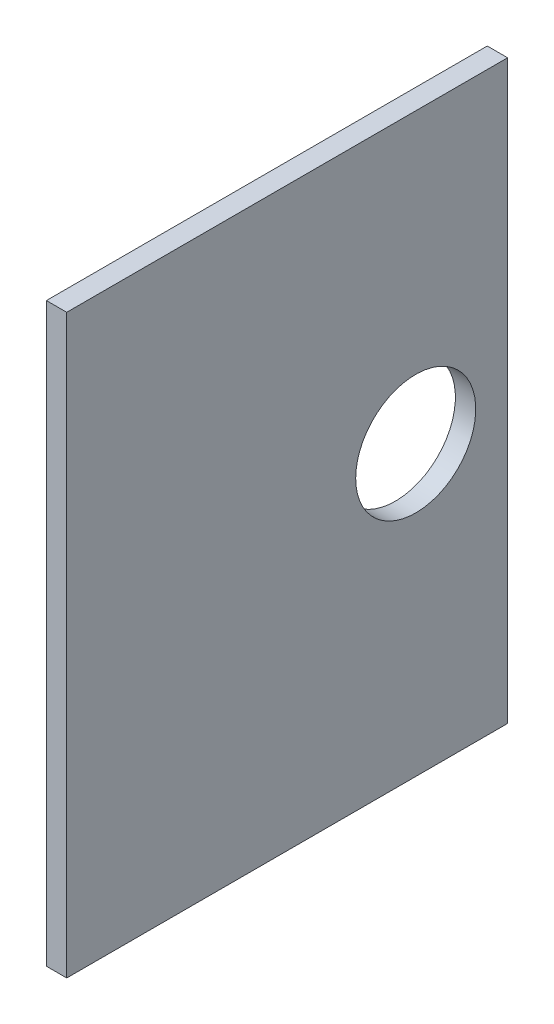
ISO-10303-21;
HEADER;
FILE_DESCRIPTION(('STEP AP214'),'2;1');
FILE_NAME('part.step','',(''),(''),'','','');
FILE_SCHEMA(('AUTOMOTIVE_DESIGN { 1 0 10303 214 1 1 1 1 }'));
ENDSEC;
DATA;
#1=APPLICATION_CONTEXT('core data for automotive mechanical design processes');
#2=APPLICATION_PROTOCOL_DEFINITION('international standard','automotive_design',2000,#1);
#3=PRODUCT_CONTEXT('',#1,'mechanical');
#4=PRODUCT('Part','Part','',(#3));
#5=PRODUCT_RELATED_PRODUCT_CATEGORY('part','',(#4));
#6=PRODUCT_DEFINITION_FORMATION('','',#4);
#7=PRODUCT_DEFINITION_CONTEXT('part definition',#1,'design');
#8=PRODUCT_DEFINITION('design','',#6,#7);
#9=PRODUCT_DEFINITION_SHAPE('','',#8);
#10=(LENGTH_UNIT() NAMED_UNIT(*) SI_UNIT(.MILLI.,.METRE.));
#11=(NAMED_UNIT(*) PLANE_ANGLE_UNIT() SI_UNIT($,.RADIAN.));
#12=(NAMED_UNIT(*) SI_UNIT($,.STERADIAN.) SOLID_ANGLE_UNIT());
#13=UNCERTAINTY_MEASURE_WITH_UNIT(LENGTH_MEASURE(1.E-05),#10,'distance_accuracy_value','');
#14=(GEOMETRIC_REPRESENTATION_CONTEXT(3) GLOBAL_UNCERTAINTY_ASSIGNED_CONTEXT((#13)) GLOBAL_UNIT_ASSIGNED_CONTEXT((#10,
#11,#12)) REPRESENTATION_CONTEXT('',''));
#15=CARTESIAN_POINT('',(0.,0.,0.));
#16=DIRECTION('',(0.,0.,1.));
#17=DIRECTION('',(1.,0.,0.));
#18=AXIS2_PLACEMENT_3D('',#15,#16,#17);
#19=CARTESIAN_POINT('',(7.62,0.,0.));
#20=DIRECTION('',(-1.,0.,0.));
#21=DIRECTION('',(0.,0.,1.));
#22=AXIS2_PLACEMENT_3D('',#19,#20,#21);
#23=PLANE('',#22);
#24=DIRECTION('',(0.,1.,0.));
#25=VECTOR('',#24,1.);
#26=CARTESIAN_POINT('',(7.62,-107.95,-82.55));
#27=LINE('',#26,#25);
#28=CARTESIAN_POINT('',(7.62,-107.95,-82.55));
#29=VERTEX_POINT('',#28);
#30=CARTESIAN_POINT('',(7.62,107.95,-82.55));
#31=VERTEX_POINT('',#30);
#32=EDGE_CURVE('E85',#29,#31,#27,.T.);
#33=ORIENTED_EDGE('',*,*,#32,.T.);
#34=DIRECTION('',(0.,0.,1.));
#35=VECTOR('',#34,1.);
#36=CARTESIAN_POINT('',(7.62,107.95,82.55));
#37=LINE('',#36,#35);
#38=CARTESIAN_POINT('',(7.62,107.95,82.55));
#39=VERTEX_POINT('',#38);
#40=EDGE_CURVE('E80',#31,#39,#37,.T.);
#41=ORIENTED_EDGE('',*,*,#40,.T.);
#42=DIRECTION('',(0.,-1.,0.));
#43=VECTOR('',#42,1.);
#44=CARTESIAN_POINT('',(7.62,-107.95,82.55));
#45=LINE('',#44,#43);
#46=CARTESIAN_POINT('',(7.62,-107.95,82.55));
#47=VERTEX_POINT('',#46);
#48=EDGE_CURVE('E83',#39,#47,#45,.T.);
#49=ORIENTED_EDGE('',*,*,#48,.T.);
#50=DIRECTION('',(0.,0.,-1.));
#51=VECTOR('',#50,1.);
#52=CARTESIAN_POINT('',(7.62,-107.95,82.55));
#53=LINE('',#52,#51);
#54=EDGE_CURVE('E50',#47,#29,#53,.T.);
#55=ORIENTED_EDGE('',*,*,#54,.T.);
#56=EDGE_LOOP('',(#33,#41,#49,#55));
#57=FACE_BOUND('',#56,.T.);
#58=CARTESIAN_POINT('',(7.62,0.,-48.1329067055647));
#59=DIRECTION('',(1.,0.,0.));
#60=DIRECTION('',(0.,0.,-1.));
#61=AXIS2_PLACEMENT_3D('',#58,#59,#60);
#62=CIRCLE('',#61,22.479);
#63=CARTESIAN_POINT('',(7.62,0.,-25.6539067055647));
#64=VERTEX_POINT('',#63);
#65=EDGE_CURVE('E100',#64,#64,#62,.T.);
#66=ORIENTED_EDGE('',*,*,#65,.F.);
#67=EDGE_LOOP('',(#66));
#68=FACE_BOUND('',#67,.T.);
#69=ADVANCED_FACE('F33',(#57,#68),#23,.F.);
#70=CARTESIAN_POINT('',(0.,0.,0.));
#71=DIRECTION('',(-1.,0.,0.));
#72=DIRECTION('',(0.,0.,1.));
#73=AXIS2_PLACEMENT_3D('',#70,#71,#72);
#74=PLANE('',#73);
#75=DIRECTION('',(0.,1.,0.));
#76=VECTOR('',#75,1.);
#77=CARTESIAN_POINT('',(0.,-107.95,-82.55));
#78=LINE('',#77,#76);
#79=CARTESIAN_POINT('',(0.,-107.95,-82.55));
#80=VERTEX_POINT('',#79);
#81=CARTESIAN_POINT('',(0.,107.95,-82.55));
#82=VERTEX_POINT('',#81);
#83=EDGE_CURVE('E97',#80,#82,#78,.T.);
#84=ORIENTED_EDGE('',*,*,#83,.F.);
#85=DIRECTION('',(0.,0.,-1.));
#86=VECTOR('',#85,1.);
#87=CARTESIAN_POINT('',(0.,-107.95,82.55));
#88=LINE('',#87,#86);
#89=CARTESIAN_POINT('',(0.,-107.95,82.55));
#90=VERTEX_POINT('',#89);
#91=EDGE_CURVE('E73',#90,#80,#88,.T.);
#92=ORIENTED_EDGE('',*,*,#91,.F.);
#93=DIRECTION('',(0.,-1.,0.));
#94=VECTOR('',#93,1.);
#95=CARTESIAN_POINT('',(0.,-107.95,82.55));
#96=LINE('',#95,#94);
#97=CARTESIAN_POINT('',(0.,107.95,82.55));
#98=VERTEX_POINT('',#97);
#99=EDGE_CURVE('E67',#98,#90,#96,.T.);
#100=ORIENTED_EDGE('',*,*,#99,.F.);
#101=DIRECTION('',(0.,0.,1.));
#102=VECTOR('',#101,1.);
#103=CARTESIAN_POINT('',(0.,107.95,82.55));
#104=LINE('',#103,#102);
#105=EDGE_CURVE('E89',#82,#98,#104,.T.);
#106=ORIENTED_EDGE('',*,*,#105,.F.);
#107=EDGE_LOOP('',(#84,#92,#100,#106));
#108=FACE_BOUND('',#107,.T.);
#109=CARTESIAN_POINT('',(0.,0.,-48.1329067055647));
#110=DIRECTION('',(1.,0.,0.));
#111=DIRECTION('',(0.,0.,-1.));
#112=AXIS2_PLACEMENT_3D('',#109,#110,#111);
#113=CIRCLE('',#112,22.479);
#114=CARTESIAN_POINT('',(0.,0.,-25.6539067055647));
#115=VERTEX_POINT('',#114);
#116=EDGE_CURVE('E112',#115,#115,#113,.T.);
#117=ORIENTED_EDGE('',*,*,#116,.T.);
#118=EDGE_LOOP('',(#117));
#119=FACE_BOUND('',#118,.T.);
#120=ADVANCED_FACE('F108',(#108,#119),#74,.T.);
#121=CARTESIAN_POINT('',(7.62,-107.95,-82.55));
#122=DIRECTION('',(0.,0.,1.));
#123=DIRECTION('',(1.,0.,0.));
#124=AXIS2_PLACEMENT_3D('',#121,#122,#123);
#125=PLANE('',#124);
#126=ORIENTED_EDGE('',*,*,#83,.T.);
#127=DIRECTION('',(-1.,0.,0.));
#128=VECTOR('',#127,1.);
#129=CARTESIAN_POINT('',(7.62,107.95,-82.55));
#130=LINE('',#129,#128);
#131=EDGE_CURVE('E11',#31,#82,#130,.T.);
#132=ORIENTED_EDGE('',*,*,#131,.F.);
#133=ORIENTED_EDGE('',*,*,#32,.F.);
#134=DIRECTION('',(-1.,0.,0.));
#135=VECTOR('',#134,1.);
#136=CARTESIAN_POINT('',(7.62,-107.95,-82.55));
#137=LINE('',#136,#135);
#138=EDGE_CURVE('E93',#29,#80,#137,.T.);
#139=ORIENTED_EDGE('',*,*,#138,.T.);
#140=EDGE_LOOP('',(#126,#132,#133,#139));
#141=FACE_BOUND('',#140,.T.);
#142=ADVANCED_FACE('F35',(#141),#125,.F.);
#143=CARTESIAN_POINT('',(7.62,107.95,82.55));
#144=DIRECTION('',(0.,-1.,0.));
#145=DIRECTION('',(0.,0.,-1.));
#146=AXIS2_PLACEMENT_3D('',#143,#144,#145);
#147=PLANE('',#146);
#148=ORIENTED_EDGE('',*,*,#105,.T.);
#149=DIRECTION('',(-1.,0.,0.));
#150=VECTOR('',#149,1.);
#151=CARTESIAN_POINT('',(7.62,107.95,82.55));
#152=LINE('',#151,#150);
#153=EDGE_CURVE('E42',#39,#98,#152,.T.);
#154=ORIENTED_EDGE('',*,*,#153,.F.);
#155=ORIENTED_EDGE('',*,*,#40,.F.);
#156=ORIENTED_EDGE('',*,*,#131,.T.);
#157=EDGE_LOOP('',(#148,#154,#155,#156));
#158=FACE_BOUND('',#157,.T.);
#159=ADVANCED_FACE('F88',(#158),#147,.F.);
#160=CARTESIAN_POINT('',(7.62,-107.95,82.55));
#161=DIRECTION('',(0.,0.,-1.));
#162=DIRECTION('',(-1.,0.,0.));
#163=AXIS2_PLACEMENT_3D('',#160,#161,#162);
#164=PLANE('',#163);
#165=ORIENTED_EDGE('',*,*,#99,.T.);
#166=DIRECTION('',(-1.,0.,0.));
#167=VECTOR('',#166,1.);
#168=CARTESIAN_POINT('',(7.62,-107.95,82.55));
#169=LINE('',#168,#167);
#170=EDGE_CURVE('E90',#47,#90,#169,.T.);
#171=ORIENTED_EDGE('',*,*,#170,.F.);
#172=ORIENTED_EDGE('',*,*,#48,.F.);
#173=ORIENTED_EDGE('',*,*,#153,.T.);
#174=EDGE_LOOP('',(#165,#171,#172,#173));
#175=FACE_BOUND('',#174,.T.);
#176=ADVANCED_FACE('F91',(#175),#164,.F.);
#177=CARTESIAN_POINT('',(7.62,-107.95,82.55));
#178=DIRECTION('',(0.,1.,0.));
#179=DIRECTION('',(0.,0.,1.));
#180=AXIS2_PLACEMENT_3D('',#177,#178,#179);
#181=PLANE('',#180);
#182=ORIENTED_EDGE('',*,*,#91,.T.);
#183=ORIENTED_EDGE('',*,*,#138,.F.);
#184=ORIENTED_EDGE('',*,*,#54,.F.);
#185=ORIENTED_EDGE('',*,*,#170,.T.);
#186=EDGE_LOOP('',(#182,#183,#184,#185));
#187=FACE_BOUND('',#186,.T.);
#188=ADVANCED_FACE('F105',(#187),#181,.F.);
#189=CARTESIAN_POINT('',(7.62,0.,-48.1329067055647));
#190=DIRECTION('',(-1.,0.,0.));
#191=DIRECTION('',(0.,0.,1.));
#192=AXIS2_PLACEMENT_3D('',#189,#190,#191);
#193=CYLINDRICAL_SURFACE('',#192,22.479);
#194=CARTESIAN_POINT('',(7.62,0.,-25.6539067055647));
#195=CARTESIAN_POINT('',(7.540625,0.,-25.6539067055647));
#196=CARTESIAN_POINT('',(7.46125,0.,-25.6539067055647));
#197=CARTESIAN_POINT('',(7.3025,0.,-25.6539067055647));
#198=CARTESIAN_POINT('',(7.223125,0.,-25.6539067055647));
#199=CARTESIAN_POINT('',(7.064375,0.,-25.6539067055647));
#200=CARTESIAN_POINT('',(6.985,0.,-25.6539067055647));
#201=CARTESIAN_POINT('',(6.82625,0.,-25.6539067055647));
#202=CARTESIAN_POINT('',(6.746875,0.,-25.6539067055647));
#203=CARTESIAN_POINT('',(6.588125,0.,-25.6539067055647));
#204=CARTESIAN_POINT('',(6.50875,0.,-25.6539067055647));
#205=CARTESIAN_POINT('',(6.35,0.,-25.6539067055647));
#206=CARTESIAN_POINT('',(6.270625,0.,-25.6539067055647));
#207=CARTESIAN_POINT('',(6.111875,0.,-25.6539067055647));
#208=CARTESIAN_POINT('',(6.0325,0.,-25.6539067055647));
#209=CARTESIAN_POINT('',(5.87375,0.,-25.6539067055647));
#210=CARTESIAN_POINT('',(5.794375,0.,-25.6539067055647));
#211=CARTESIAN_POINT('',(5.635625,0.,-25.6539067055647));
#212=CARTESIAN_POINT('',(5.55625,0.,-25.6539067055647));
#213=CARTESIAN_POINT('',(5.3975,0.,-25.6539067055647));
#214=CARTESIAN_POINT('',(5.318125,0.,-25.6539067055647));
#215=CARTESIAN_POINT('',(5.159375,0.,-25.6539067055647));
#216=CARTESIAN_POINT('',(5.08,0.,-25.6539067055647));
#217=CARTESIAN_POINT('',(4.92125,0.,-25.6539067055647));
#218=CARTESIAN_POINT('',(4.841875,0.,-25.6539067055647));
#219=CARTESIAN_POINT('',(4.683125,0.,-25.6539067055647));
#220=CARTESIAN_POINT('',(4.60375,0.,-25.6539067055647));
#221=CARTESIAN_POINT('',(4.445,0.,-25.6539067055647));
#222=CARTESIAN_POINT('',(4.365625,0.,-25.6539067055647));
#223=CARTESIAN_POINT('',(4.206875,0.,-25.6539067055647));
#224=CARTESIAN_POINT('',(4.1275,0.,-25.6539067055647));
#225=CARTESIAN_POINT('',(3.96875,0.,-25.6539067055647));
#226=CARTESIAN_POINT('',(3.889375,0.,-25.6539067055647));
#227=CARTESIAN_POINT('',(3.730625,0.,-25.6539067055647));
#228=CARTESIAN_POINT('',(3.65125,0.,-25.6539067055647));
#229=CARTESIAN_POINT('',(3.4925,0.,-25.6539067055647));
#230=CARTESIAN_POINT('',(3.413125,0.,-25.6539067055647));
#231=CARTESIAN_POINT('',(3.254375,0.,-25.6539067055647));
#232=CARTESIAN_POINT('',(3.175,0.,-25.6539067055647));
#233=CARTESIAN_POINT('',(3.01625,0.,-25.6539067055647));
#234=CARTESIAN_POINT('',(2.936875,0.,-25.6539067055647));
#235=CARTESIAN_POINT('',(2.778125,0.,-25.6539067055647));
#236=CARTESIAN_POINT('',(2.69875,0.,-25.6539067055647));
#237=CARTESIAN_POINT('',(2.54,0.,-25.6539067055647));
#238=CARTESIAN_POINT('',(2.460625,0.,-25.6539067055647));
#239=CARTESIAN_POINT('',(2.301875,0.,-25.6539067055647));
#240=CARTESIAN_POINT('',(2.2225,0.,-25.6539067055647));
#241=CARTESIAN_POINT('',(2.06375,0.,-25.6539067055647));
#242=CARTESIAN_POINT('',(1.984375,0.,-25.6539067055647));
#243=CARTESIAN_POINT('',(1.825625,0.,-25.6539067055647));
#244=CARTESIAN_POINT('',(1.74625,0.,-25.6539067055647));
#245=CARTESIAN_POINT('',(1.5875,0.,-25.6539067055647));
#246=CARTESIAN_POINT('',(1.508125,0.,-25.6539067055647));
#247=CARTESIAN_POINT('',(1.349375,0.,-25.6539067055647));
#248=CARTESIAN_POINT('',(1.27,0.,-25.6539067055647));
#249=CARTESIAN_POINT('',(1.11125,0.,-25.6539067055647));
#250=CARTESIAN_POINT('',(1.031875,0.,-25.6539067055647));
#251=CARTESIAN_POINT('',(0.873125,0.,-25.6539067055647));
#252=CARTESIAN_POINT('',(0.79375,0.,-25.6539067055647));
#253=CARTESIAN_POINT('',(0.635,0.,-25.6539067055647));
#254=CARTESIAN_POINT('',(0.555625,0.,-25.6539067055647));
#255=CARTESIAN_POINT('',(0.396875,0.,-25.6539067055647));
#256=CARTESIAN_POINT('',(0.3175,0.,-25.6539067055647));
#257=CARTESIAN_POINT('',(0.15875,0.,-25.6539067055647));
#258=CARTESIAN_POINT('',(0.0793749999999999,0.,-25.6539067055647));
#259=CARTESIAN_POINT('',(0.,0.,-25.6539067055647));
#260=B_SPLINE_CURVE_WITH_KNOTS('',3,(#194,#195,#196,#197,#198,#199,#200,#201,#202,#203,#204,
#205,#206,#207,#208,#209,#210,#211,#212,#213,#214,#215,#216,#217,#218,#219,#220,#221,#222,#223,
#224,#225,#226,#227,#228,#229,#230,#231,#232,#233,#234,#235,#236,#237,#238,#239,#240,#241,#242,
#243,#244,#245,#246,#247,#248,#249,#250,#251,#252,#253,#254,#255,#256,#257,#258,#259),
.UNSPECIFIED.,.F.,.F.,(4,2,2,2,2,2,2,2,2,2,2,2,2,2,2,2,2,2,2,2,2,2,2,2,2,2,2,2,2,2,2,2,4),(0.,
0.238125,0.47625,0.714375000000001,0.9525,1.190625,1.42875,1.666875,1.905,2.143125,2.38125,
2.619375,2.8575,3.095625,3.33375,3.571875,3.81,4.048125,4.28625,4.524375,4.7625,5.000625,
5.23875,5.476875,5.715,5.953125,6.19125,6.429375,6.6675,6.905625,7.14375,7.381875,7.62),.UNSPECIFIED.);
#261=EDGE_CURVE('BSEAM118',#64,#115,#260,.T.);
#262=ORIENTED_EDGE('',*,*,#65,.T.);
#263=ORIENTED_EDGE('',*,*,#116,.F.);
#264=ORIENTED_EDGE('',*,*,#261,.T.);
#265=ORIENTED_EDGE('',*,*,#261,.F.);
#266=EDGE_LOOP('',(#262,#264,#263,#265));
#267=FACE_BOUND('',#266,.T.);
#268=ADVANCED_FACE('F118',(#267),#193,.F.);
#269=CLOSED_SHELL('',(#69,#120,#142,#159,#176,#188,#268));
#270=MANIFOLD_SOLID_BREP('B2',#269);
#271=ADVANCED_BREP_SHAPE_REPRESENTATION('',(#18,#270),#14);
#272=SHAPE_DEFINITION_REPRESENTATION(#9,#271);
ENDSEC;
END-ISO-10303-21;
